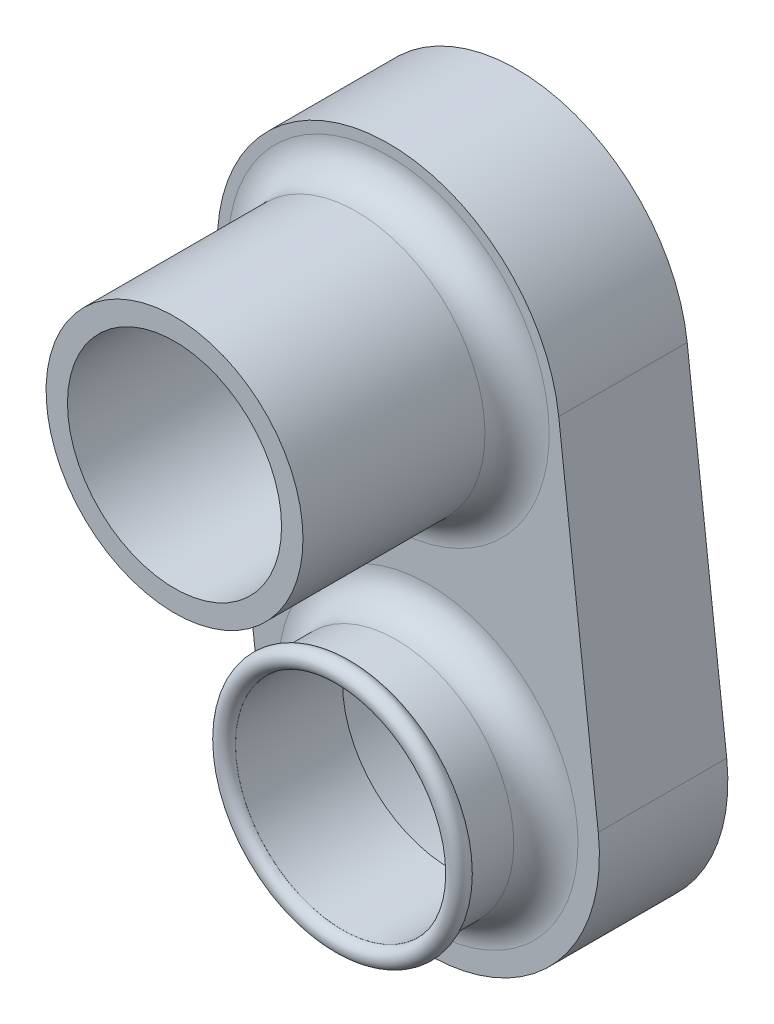
ISO-10303-21;
HEADER;
FILE_DESCRIPTION(('STEP AP214'),'2;1');
FILE_NAME('part.step','',(''),(''),'','','');
FILE_SCHEMA(('AUTOMOTIVE_DESIGN { 1 0 10303 214 1 1 1 1 }'));
ENDSEC;
DATA;
#1=APPLICATION_CONTEXT('core data for automotive mechanical design processes');
#2=APPLICATION_PROTOCOL_DEFINITION('international standard','automotive_design',2000,#1);
#3=PRODUCT_CONTEXT('',#1,'mechanical');
#4=PRODUCT('Part','Part','',(#3));
#5=PRODUCT_RELATED_PRODUCT_CATEGORY('part','',(#4));
#6=PRODUCT_DEFINITION_FORMATION('','',#4);
#7=PRODUCT_DEFINITION_CONTEXT('part definition',#1,'design');
#8=PRODUCT_DEFINITION('design','',#6,#7);
#9=PRODUCT_DEFINITION_SHAPE('','',#8);
#10=(LENGTH_UNIT() NAMED_UNIT(*) SI_UNIT(.MILLI.,.METRE.));
#11=(NAMED_UNIT(*) PLANE_ANGLE_UNIT() SI_UNIT($,.RADIAN.));
#12=(NAMED_UNIT(*) SI_UNIT($,.STERADIAN.) SOLID_ANGLE_UNIT());
#13=UNCERTAINTY_MEASURE_WITH_UNIT(LENGTH_MEASURE(1.E-05),#10,'distance_accuracy_value','');
#14=(GEOMETRIC_REPRESENTATION_CONTEXT(3) GLOBAL_UNCERTAINTY_ASSIGNED_CONTEXT((#13)) GLOBAL_UNIT_ASSIGNED_CONTEXT((#10,
#11,#12)) REPRESENTATION_CONTEXT('',''));
#15=CARTESIAN_POINT('',(0.,0.,0.));
#16=DIRECTION('',(0.,0.,1.));
#17=DIRECTION('',(1.,0.,0.));
#18=AXIS2_PLACEMENT_3D('',#15,#16,#17);
#19=CARTESIAN_POINT('',(550.233603989508,25.6899886030883,240.190394221551));
#20=DIRECTION('',(0.,0.,1.));
#21=DIRECTION('',(-0.993314481568456,-0.115439770904089,0.));
#22=AXIS2_PLACEMENT_3D('',#19,#20,#21);
#23=PLANE('',#22);
#24=CARTESIAN_POINT('',(550.233603989508,25.6899886030883,240.190394221551));
#25=DIRECTION('',(0.,0.,1.));
#26=DIRECTION('',(-0.993314481568456,-0.115439770904089,0.));
#27=AXIS2_PLACEMENT_3D('',#24,#25,#26);
#28=CIRCLE('',#27,10.);
#29=CARTESIAN_POINT('',(540.300459173823,24.5355908940474,240.190394221551));
#30=VERTEX_POINT('',#29);
#31=EDGE_CURVE('E155',#30,#30,#28,.T.);
#32=ORIENTED_EDGE('',*,*,#31,.F.);
#33=EDGE_LOOP('',(#32));
#34=FACE_BOUND('',#33,.T.);
#35=CARTESIAN_POINT('',(550.233603989508,25.6899886030883,240.190394221551));
#36=DIRECTION('',(0.,0.,-1.));
#37=DIRECTION('',(0.993314481568456,0.115439770904089,0.));
#38=AXIS2_PLACEMENT_3D('',#35,#36,#37);
#39=CIRCLE('',#38,10.0065008978472);
#40=CARTESIAN_POINT('',(560.173206241167,26.8451367742873,240.190394221551));
#41=VERTEX_POINT('',#40);
#42=EDGE_CURVE('E152',#41,#41,#39,.F.);
#43=ORIENTED_EDGE('',*,*,#42,.T.);
#44=EDGE_LOOP('',(#43));
#45=FACE_BOUND('',#44,.T.);
#46=ADVANCED_FACE('F40',(#34,#45),#23,.T.);
#47=CARTESIAN_POINT('',(550.233603989508,25.6899886030883,240.190394221551));
#48=DIRECTION('',(0.,0.,-1.));
#49=DIRECTION('',(0.993314481568456,0.115439770904089,0.));
#50=AXIS2_PLACEMENT_3D('',#47,#48,#49);
#51=CYLINDRICAL_SURFACE('',#50,11.);
#52=CARTESIAN_POINT('',(550.233603989508,25.6899886030883,235.190394221551));
#53=DIRECTION('',(0.,0.,-1.));
#54=DIRECTION('',(0.993314481568456,0.115439770904089,0.));
#55=AXIS2_PLACEMENT_3D('',#52,#53,#54);
#56=CIRCLE('',#55,11.);
#57=CARTESIAN_POINT('',(561.160063286761,26.9598260830333,235.190394221551));
#58=VERTEX_POINT('',#57);
#59=EDGE_CURVE('E11',#58,#58,#56,.F.);
#60=ORIENTED_EDGE('',*,*,#59,.T.);
#61=EDGE_LOOP('',(#60));
#62=FACE_BOUND('',#61,.T.);
#63=CARTESIAN_POINT('',(550.233603989508,25.6899886030883,239.318403734785));
#64=DIRECTION('',(0.,0.,1.));
#65=DIRECTION('',(-0.993314481568456,-0.115439770904089,0.));
#66=AXIS2_PLACEMENT_3D('',#63,#64,#65);
#67=CIRCLE('',#66,11.);
#68=CARTESIAN_POINT('',(539.307144692255,24.4201511231433,239.318403734785));
#69=VERTEX_POINT('',#68);
#70=EDGE_CURVE('E191',#69,#69,#67,.T.);
#71=ORIENTED_EDGE('',*,*,#70,.F.);
#72=EDGE_LOOP('',(#71));
#73=FACE_BOUND('',#72,.T.);
#74=ADVANCED_FACE('F215',(#62,#73),#51,.T.);
#75=CARTESIAN_POINT('',(546.539531320577,57.4760520132789,232.190394221551));
#76=DIRECTION('',(0.,0.,-1.));
#77=DIRECTION('',(0.993314481568456,0.115439770904089,0.));
#78=AXIS2_PLACEMENT_3D('',#75,#76,#77);
#79=PLANE('',#78);
#80=CARTESIAN_POINT('',(546.539531320577,57.4760520132789,232.190394221551));
#81=DIRECTION('',(0.,0.,-1.));
#82=DIRECTION('',(0.993314481568456,0.115439770904089,0.));
#83=AXIS2_PLACEMENT_3D('',#80,#81,#82);
#84=CIRCLE('',#83,15.);
#85=CARTESIAN_POINT('',(561.439248544104,59.2076485768402,232.190394221551));
#86=VERTEX_POINT('',#85);
#87=EDGE_CURVE('E197',#86,#86,#84,.T.);
#88=ORIENTED_EDGE('',*,*,#87,.T.);
#89=EDGE_LOOP('',(#88));
#90=FACE_BOUND('',#89,.T.);
#91=CARTESIAN_POINT('',(550.233603989508,25.6899886030883,232.190394221551));
#92=DIRECTION('',(0.,0.,-1.));
#93=DIRECTION('',(0.993314481568456,0.115439770904089,0.));
#94=AXIS2_PLACEMENT_3D('',#91,#92,#93);
#95=CIRCLE('',#94,14.);
#96=CARTESIAN_POINT('',(564.140006731466,27.3061453957455,232.190394221551));
#97=VERTEX_POINT('',#96);
#98=EDGE_CURVE('E194',#97,#97,#95,.T.);
#99=ORIENTED_EDGE('',*,*,#98,.T.);
#100=EDGE_LOOP('',(#99));
#101=FACE_BOUND('',#100,.T.);
#102=CARTESIAN_POINT('',(546.539531320577,57.4760520132789,232.190394221551));
#103=DIRECTION('',(0.,0.,-1.));
#104=DIRECTION('',(0.993314481568456,0.115439770904089,0.));
#105=AXIS2_PLACEMENT_3D('',#102,#103,#104);
#106=CIRCLE('',#105,16.);
#107=CARTESIAN_POINT('',(530.646499615482,55.6290156788135,232.190394221551));
#108=VERTEX_POINT('',#107);
#109=CARTESIAN_POINT('',(562.432563025672,59.3230883477443,232.190394221551));
#110=VERTEX_POINT('',#109);
#111=EDGE_CURVE('E164',#108,#110,#106,.T.);
#112=ORIENTED_EDGE('',*,*,#111,.F.);
#113=DIRECTION('',(-0.115439770904089,0.993314481568456,0.));
#114=VECTOR('',#113,1.);
#115=CARTESIAN_POINT('',(530.646499615482,55.6290156788135,232.190394221551));
#116=LINE('',#115,#114);
#117=CARTESIAN_POINT('',(534.340572284412,23.8429522686229,232.190394221551));
#118=VERTEX_POINT('',#117);
#119=EDGE_CURVE('E171',#118,#108,#116,.T.);
#120=ORIENTED_EDGE('',*,*,#119,.F.);
#121=CARTESIAN_POINT('',(550.233603989508,25.6899886030883,232.190394221551));
#122=DIRECTION('',(0.,0.,-1.));
#123=DIRECTION('',(-0.993314481568456,-0.115439770904089,0.));
#124=AXIS2_PLACEMENT_3D('',#121,#122,#123);
#125=CIRCLE('',#124,16.);
#126=CARTESIAN_POINT('',(566.126635694603,27.5370249375537,232.190394221551));
#127=VERTEX_POINT('',#126);
#128=EDGE_CURVE('E169',#127,#118,#125,.T.);
#129=ORIENTED_EDGE('',*,*,#128,.F.);
#130=DIRECTION('',(0.115439770904089,-0.993314481568456,0.));
#131=VECTOR('',#130,1.);
#132=CARTESIAN_POINT('',(562.432563025672,59.3230883477443,232.190394221551));
#133=LINE('',#132,#131);
#134=EDGE_CURVE('E167',#110,#127,#133,.T.);
#135=ORIENTED_EDGE('',*,*,#134,.F.);
#136=EDGE_LOOP('',(#112,#120,#129,#135));
#137=FACE_BOUND('',#136,.T.);
#138=ADVANCED_FACE('F211',(#90,#101,#137),#79,.F.);
#139=CARTESIAN_POINT('',(546.539531320577,57.4760520132789,252.190394221551));
#140=DIRECTION('',(0.,0.,-1.));
#141=DIRECTION('',(0.993314481568456,0.115439770904089,0.));
#142=AXIS2_PLACEMENT_3D('',#139,#140,#141);
#143=PLANE('',#142);
#144=CARTESIAN_POINT('',(546.539531320577,57.4760520132789,252.190394221551));
#145=DIRECTION('',(0.,0.,-1.));
#146=DIRECTION('',(0.993314481568456,0.115439770904089,0.));
#147=AXIS2_PLACEMENT_3D('',#144,#145,#146);
#148=CIRCLE('',#147,12.);
#149=CARTESIAN_POINT('',(558.459305099398,58.861329264128,252.190394221551));
#150=VERTEX_POINT('',#149);
#151=EDGE_CURVE('E188',#150,#150,#148,.T.);
#152=ORIENTED_EDGE('',*,*,#151,.F.);
#153=EDGE_LOOP('',(#152));
#154=FACE_BOUND('',#153,.T.);
#155=CARTESIAN_POINT('',(546.539531320577,57.4760520132789,252.190394221551));
#156=DIRECTION('',(0.,0.,-1.));
#157=DIRECTION('',(0.993314481568456,0.115439770904089,0.));
#158=AXIS2_PLACEMENT_3D('',#155,#156,#157);
#159=CIRCLE('',#158,10.);
#160=CARTESIAN_POINT('',(556.472676136261,58.6304497223198,252.190394221551));
#161=VERTEX_POINT('',#160);
#162=EDGE_CURVE('E185',#161,#161,#159,.T.);
#163=ORIENTED_EDGE('',*,*,#162,.T.);
#164=EDGE_LOOP('',(#163));
#165=FACE_BOUND('',#164,.T.);
#166=ADVANCED_FACE('F214',(#154,#165),#143,.F.);
#167=CARTESIAN_POINT('',(546.539531320577,57.4760520132789,232.190394221551));
#168=DIRECTION('',(0.,0.,1.));
#169=DIRECTION('',(-0.993314481568456,-0.115439770904089,0.));
#170=AXIS2_PLACEMENT_3D('',#167,#168,#169);
#171=CYLINDRICAL_SURFACE('',#170,12.);
#172=CARTESIAN_POINT('',(546.539531320577,57.4760520132789,235.190394221551));
#173=DIRECTION('',(0.,0.,-1.));
#174=DIRECTION('',(0.993314481568456,0.115439770904089,0.));
#175=AXIS2_PLACEMENT_3D('',#172,#173,#174);
#176=CIRCLE('',#175,12.);
#177=CARTESIAN_POINT('',(558.459305099398,58.861329264128,235.190394221551));
#178=VERTEX_POINT('',#177);
#179=EDGE_CURVE('E48',#178,#178,#176,.F.);
#180=ORIENTED_EDGE('',*,*,#179,.T.);
#181=EDGE_LOOP('',(#180));
#182=FACE_BOUND('',#181,.T.);
#183=ORIENTED_EDGE('',*,*,#151,.T.);
#184=EDGE_LOOP('',(#183));
#185=FACE_BOUND('',#184,.T.);
#186=ADVANCED_FACE('F202',(#182,#185),#171,.T.);
#187=CARTESIAN_POINT('',(546.539531320577,57.4760520132789,232.190394221551));
#188=DIRECTION('',(0.,0.,1.));
#189=DIRECTION('',(-0.993314481568456,-0.115439770904089,0.));
#190=AXIS2_PLACEMENT_3D('',#187,#188,#189);
#191=CYLINDRICAL_SURFACE('',#190,10.);
#192=ORIENTED_EDGE('',*,*,#162,.F.);
#193=EDGE_LOOP('',(#192));
#194=FACE_BOUND('',#193,.T.);
#195=CARTESIAN_POINT('',(546.539531320577,57.4760520132789,230.190394221551));
#196=DIRECTION('',(0.,0.,-1.));
#197=DIRECTION('',(0.993314481568456,0.115439770904089,0.));
#198=AXIS2_PLACEMENT_3D('',#195,#196,#197);
#199=CIRCLE('',#198,10.);
#200=CARTESIAN_POINT('',(556.472676136261,58.6304497223198,230.190394221551));
#201=VERTEX_POINT('',#200);
#202=EDGE_CURVE('E161',#201,#201,#199,.T.);
#203=ORIENTED_EDGE('',*,*,#202,.T.);
#204=EDGE_LOOP('',(#203));
#205=FACE_BOUND('',#204,.T.);
#206=ADVANCED_FACE('F263',(#194,#205),#191,.F.);
#207=CARTESIAN_POINT('',(546.539531320577,57.4760520132789,230.190394221551));
#208=DIRECTION('',(0.,0.,-1.));
#209=DIRECTION('',(0.993314481568456,0.115439770904089,0.));
#210=AXIS2_PLACEMENT_3D('',#207,#208,#209);
#211=PLANE('',#210);
#212=CARTESIAN_POINT('',(550.233603989508,25.6899886030883,230.190394221551));
#213=DIRECTION('',(0.,0.,-1.));
#214=DIRECTION('',(0.993314481568456,0.115439770904089,0.));
#215=AXIS2_PLACEMENT_3D('',#212,#213,#214);
#216=CIRCLE('',#215,15.);
#217=CARTESIAN_POINT('',(565.133321213034,27.4215851666496,230.190394221551));
#218=VERTEX_POINT('',#217);
#219=CARTESIAN_POINT('',(535.333886765981,23.958392039527,230.190394221551));
#220=VERTEX_POINT('',#219);
#221=EDGE_CURVE('E55',#218,#220,#216,.T.);
#222=ORIENTED_EDGE('',*,*,#221,.T.);
#223=DIRECTION('',(-0.115439770904089,0.993314481568456,0.));
#224=VECTOR('',#223,1.);
#225=CARTESIAN_POINT('',(535.333886765981,23.958392039527,230.190394221551));
#226=LINE('',#225,#224);
#227=CARTESIAN_POINT('',(531.63981409705,55.7444554497176,230.190394221551));
#228=VERTEX_POINT('',#227);
#229=EDGE_CURVE('E59',#220,#228,#226,.T.);
#230=ORIENTED_EDGE('',*,*,#229,.T.);
#231=CARTESIAN_POINT('',(546.539531320577,57.4760520132789,230.190394221551));
#232=DIRECTION('',(0.,0.,-1.));
#233=DIRECTION('',(0.993314481568456,0.115439770904089,0.));
#234=AXIS2_PLACEMENT_3D('',#231,#232,#233);
#235=CIRCLE('',#234,15.);
#236=CARTESIAN_POINT('',(561.439248544104,59.2076485768402,230.190394221551));
#237=VERTEX_POINT('',#236);
#238=EDGE_CURVE('E133',#228,#237,#235,.T.);
#239=ORIENTED_EDGE('',*,*,#238,.T.);
#240=DIRECTION('',(0.115439770904089,-0.993314481568456,0.));
#241=VECTOR('',#240,1.);
#242=CARTESIAN_POINT('',(561.439248544104,59.2076485768402,230.190394221551));
#243=LINE('',#242,#241);
#244=EDGE_CURVE('E114',#237,#218,#243,.T.);
#245=ORIENTED_EDGE('',*,*,#244,.T.);
#246=EDGE_LOOP('',(#222,#230,#239,#245));
#247=FACE_BOUND('',#246,.T.);
#248=ORIENTED_EDGE('',*,*,#202,.F.);
#249=EDGE_LOOP('',(#248));
#250=FACE_BOUND('',#249,.T.);
#251=CARTESIAN_POINT('',(550.233603989508,25.6899886030883,230.190394221551));
#252=DIRECTION('',(0.,0.,-1.));
#253=DIRECTION('',(-0.993314481568456,-0.115439770904089,0.));
#254=AXIS2_PLACEMENT_3D('',#251,#252,#253);
#255=CIRCLE('',#254,10.);
#256=CARTESIAN_POINT('',(540.300459173823,24.5355908940474,230.190394221551));
#257=VERTEX_POINT('',#256);
#258=EDGE_CURVE('E158',#257,#257,#255,.T.);
#259=ORIENTED_EDGE('',*,*,#258,.F.);
#260=EDGE_LOOP('',(#259));
#261=FACE_BOUND('',#260,.T.);
#262=ADVANCED_FACE('F242',(#247,#250,#261),#211,.T.);
#263=CARTESIAN_POINT('',(546.539531320577,57.4760520132789,230.190394221551));
#264=DIRECTION('',(0.,0.,1.));
#265=DIRECTION('',(-0.993314481568456,-0.115439770904089,0.));
#266=AXIS2_PLACEMENT_3D('',#263,#264,#265);
#267=CYLINDRICAL_SURFACE('',#266,16.);
#268=ORIENTED_EDGE('',*,*,#111,.T.);
#269=DIRECTION('',(0.,0.,1.));
#270=VECTOR('',#269,1.);
#271=CARTESIAN_POINT('',(562.432563025672,59.3230883477443,230.190394221551));
#272=LINE('',#271,#270);
#273=CARTESIAN_POINT('',(562.432563025672,59.3230883477443,220.190394221551));
#274=VERTEX_POINT('',#273);
#275=EDGE_CURVE('E182',#274,#110,#272,.T.);
#276=ORIENTED_EDGE('',*,*,#275,.F.);
#277=CARTESIAN_POINT('',(546.539531320577,57.4760520132789,220.190394221551));
#278=DIRECTION('',(0.,0.,-1.));
#279=DIRECTION('',(0.993314481568456,0.115439770904089,0.));
#280=AXIS2_PLACEMENT_3D('',#277,#278,#279);
#281=CIRCLE('',#280,16.);
#282=CARTESIAN_POINT('',(530.646499615482,55.6290156788135,220.190394221551));
#283=VERTEX_POINT('',#282);
#284=EDGE_CURVE('E119',#283,#274,#281,.T.);
#285=ORIENTED_EDGE('',*,*,#284,.F.);
#286=DIRECTION('',(0.,0.,1.));
#287=VECTOR('',#286,1.);
#288=CARTESIAN_POINT('',(530.646499615482,55.6290156788135,230.190394221551));
#289=LINE('',#288,#287);
#290=EDGE_CURVE('E173',#283,#108,#289,.T.);
#291=ORIENTED_EDGE('',*,*,#290,.T.);
#292=EDGE_LOOP('',(#268,#276,#285,#291));
#293=FACE_BOUND('',#292,.T.);
#294=ADVANCED_FACE('F223',(#293),#267,.T.);
#295=CARTESIAN_POINT('',(562.432563025672,59.3230883477443,230.190394221551));
#296=DIRECTION('',(-0.993314481568456,-0.115439770904089,0.));
#297=DIRECTION('',(-0.115439770904089,0.993314481568456,0.));
#298=AXIS2_PLACEMENT_3D('',#295,#296,#297);
#299=PLANE('',#298);
#300=ORIENTED_EDGE('',*,*,#134,.T.);
#301=DIRECTION('',(0.,0.,1.));
#302=VECTOR('',#301,1.);
#303=CARTESIAN_POINT('',(566.126635694603,27.5370249375537,230.190394221551));
#304=LINE('',#303,#302);
#305=CARTESIAN_POINT('',(566.126635694603,27.5370249375537,220.190394221551));
#306=VERTEX_POINT('',#305);
#307=EDGE_CURVE('E179',#306,#127,#304,.T.);
#308=ORIENTED_EDGE('',*,*,#307,.F.);
#309=DIRECTION('',(0.115439770904089,-0.993314481568456,0.));
#310=VECTOR('',#309,1.);
#311=CARTESIAN_POINT('',(562.432563025672,59.3230883477443,220.190394221551));
#312=LINE('',#311,#310);
#313=EDGE_CURVE('E143',#274,#306,#312,.T.);
#314=ORIENTED_EDGE('',*,*,#313,.F.);
#315=ORIENTED_EDGE('',*,*,#275,.T.);
#316=EDGE_LOOP('',(#300,#308,#314,#315));
#317=FACE_BOUND('',#316,.T.);
#318=ADVANCED_FACE('F234',(#317),#299,.F.);
#319=CARTESIAN_POINT('',(550.233603989508,25.6899886030883,230.190394221551));
#320=DIRECTION('',(0.,0.,1.));
#321=DIRECTION('',(-0.993314481568456,-0.115439770904089,0.));
#322=AXIS2_PLACEMENT_3D('',#319,#320,#321);
#323=CYLINDRICAL_SURFACE('',#322,16.);
#324=ORIENTED_EDGE('',*,*,#128,.T.);
#325=DIRECTION('',(0.,0.,1.));
#326=VECTOR('',#325,1.);
#327=CARTESIAN_POINT('',(534.340572284412,23.8429522686229,230.190394221551));
#328=LINE('',#327,#326);
#329=CARTESIAN_POINT('',(534.340572284412,23.8429522686229,220.190394221551));
#330=VERTEX_POINT('',#329);
#331=EDGE_CURVE('E176',#330,#118,#328,.T.);
#332=ORIENTED_EDGE('',*,*,#331,.F.);
#333=CARTESIAN_POINT('',(550.233603989508,25.6899886030883,220.190394221551));
#334=DIRECTION('',(0.,0.,-1.));
#335=DIRECTION('',(0.993314481568456,0.115439770904089,0.));
#336=AXIS2_PLACEMENT_3D('',#333,#334,#335);
#337=CIRCLE('',#336,16.);
#338=EDGE_CURVE('E146',#306,#330,#337,.T.);
#339=ORIENTED_EDGE('',*,*,#338,.F.);
#340=ORIENTED_EDGE('',*,*,#307,.T.);
#341=EDGE_LOOP('',(#324,#332,#339,#340));
#342=FACE_BOUND('',#341,.T.);
#343=ADVANCED_FACE('F232',(#342),#323,.T.);
#344=CARTESIAN_POINT('',(530.646499615482,55.6290156788135,230.190394221551));
#345=DIRECTION('',(0.993314481568456,0.115439770904089,0.));
#346=DIRECTION('',(0.115439770904089,-0.993314481568456,0.));
#347=AXIS2_PLACEMENT_3D('',#344,#345,#346);
#348=PLANE('',#347);
#349=ORIENTED_EDGE('',*,*,#119,.T.);
#350=ORIENTED_EDGE('',*,*,#290,.F.);
#351=DIRECTION('',(-0.115439770904089,0.993314481568456,0.));
#352=VECTOR('',#351,1.);
#353=CARTESIAN_POINT('',(534.340572284412,23.8429522686229,220.190394221551));
#354=LINE('',#353,#352);
#355=EDGE_CURVE('E149',#330,#283,#354,.T.);
#356=ORIENTED_EDGE('',*,*,#355,.F.);
#357=ORIENTED_EDGE('',*,*,#331,.T.);
#358=EDGE_LOOP('',(#349,#350,#356,#357));
#359=FACE_BOUND('',#358,.T.);
#360=ADVANCED_FACE('F228',(#359),#348,.F.);
#361=CARTESIAN_POINT('',(550.233603989508,25.6899886030883,230.190394221551));
#362=DIRECTION('',(0.,0.,1.));
#363=DIRECTION('',(-0.993314481568456,-0.115439770904089,0.));
#364=AXIS2_PLACEMENT_3D('',#361,#362,#363);
#365=CYLINDRICAL_SURFACE('',#364,10.);
#366=ORIENTED_EDGE('',*,*,#258,.T.);
#367=EDGE_LOOP('',(#366));
#368=FACE_BOUND('',#367,.T.);
#369=ORIENTED_EDGE('',*,*,#31,.T.);
#370=EDGE_LOOP('',(#369));
#371=FACE_BOUND('',#370,.T.);
#372=ADVANCED_FACE('F258',(#368,#371),#365,.F.);
#373=CARTESIAN_POINT('',(550.233603989508,25.6899886030883,240.190394221551));
#374=DIRECTION('',(0.,0.,1.));
#375=DIRECTION('',(-0.993314481568456,-0.115439770904089,0.));
#376=AXIS2_PLACEMENT_3D('',#373,#374,#375);
#377=TOROIDAL_SURFACE('',#376,10.8859218611894,0.879420963342187);
#378=ORIENTED_EDGE('',*,*,#42,.F.);
#379=EDGE_LOOP('',(#378));
#380=FACE_BOUND('',#379,.T.);
#381=ORIENTED_EDGE('',*,*,#70,.T.);
#382=EDGE_LOOP('',(#381));
#383=FACE_BOUND('',#382,.T.);
#384=ADVANCED_FACE('F255',(#380,#383),#377,.T.);
#385=CARTESIAN_POINT('',(546.539531320577,57.4760520132789,220.190394221551));
#386=DIRECTION('',(0.,0.,-1.));
#387=DIRECTION('',(0.993314481568456,0.115439770904089,0.));
#388=AXIS2_PLACEMENT_3D('',#385,#386,#387);
#389=PLANE('',#388);
#390=ORIENTED_EDGE('',*,*,#284,.T.);
#391=ORIENTED_EDGE('',*,*,#313,.T.);
#392=ORIENTED_EDGE('',*,*,#338,.T.);
#393=ORIENTED_EDGE('',*,*,#355,.T.);
#394=EDGE_LOOP('',(#390,#391,#392,#393));
#395=FACE_BOUND('',#394,.T.);
#396=DIRECTION('',(-0.115439770904089,0.993314481568456,0.));
#397=VECTOR('',#396,1.);
#398=CARTESIAN_POINT('',(535.333886765981,23.958392039527,220.190394221551));
#399=LINE('',#398,#397);
#400=CARTESIAN_POINT('',(535.333886765981,23.958392039527,220.190394221551));
#401=VERTEX_POINT('',#400);
#402=CARTESIAN_POINT('',(531.63981409705,55.7444554497176,220.190394221551));
#403=VERTEX_POINT('',#402);
#404=EDGE_CURVE('E113',#401,#403,#399,.T.);
#405=ORIENTED_EDGE('',*,*,#404,.F.);
#406=CARTESIAN_POINT('',(550.233603989508,25.6899886030883,220.190394221551));
#407=DIRECTION('',(0.,0.,-1.));
#408=DIRECTION('',(0.993314481568456,0.115439770904089,0.));
#409=AXIS2_PLACEMENT_3D('',#406,#407,#408);
#410=CIRCLE('',#409,15.);
#411=CARTESIAN_POINT('',(565.133321213034,27.4215851666496,220.190394221551));
#412=VERTEX_POINT('',#411);
#413=EDGE_CURVE('E104',#412,#401,#410,.T.);
#414=ORIENTED_EDGE('',*,*,#413,.F.);
#415=DIRECTION('',(0.115439770904089,-0.993314481568456,0.));
#416=VECTOR('',#415,1.);
#417=CARTESIAN_POINT('',(561.439248544104,59.2076485768402,220.190394221551));
#418=LINE('',#417,#416);
#419=CARTESIAN_POINT('',(561.439248544104,59.2076485768402,220.190394221551));
#420=VERTEX_POINT('',#419);
#421=EDGE_CURVE('E127',#420,#412,#418,.T.);
#422=ORIENTED_EDGE('',*,*,#421,.F.);
#423=CARTESIAN_POINT('',(546.539531320577,57.4760520132789,220.190394221551));
#424=DIRECTION('',(0.,0.,-1.));
#425=DIRECTION('',(0.993314481568456,0.115439770904089,0.));
#426=AXIS2_PLACEMENT_3D('',#423,#424,#425);
#427=CIRCLE('',#426,15.);
#428=EDGE_CURVE('E125',#403,#420,#427,.T.);
#429=ORIENTED_EDGE('',*,*,#428,.F.);
#430=EDGE_LOOP('',(#405,#414,#422,#429));
#431=FACE_BOUND('',#430,.T.);
#432=ADVANCED_FACE('F123',(#395,#431),#389,.T.);
#433=CARTESIAN_POINT('',(550.233603989508,25.6899886030883,220.190394221551));
#434=DIRECTION('',(0.,0.,1.));
#435=DIRECTION('',(-0.993314481568456,-0.115439770904089,0.));
#436=AXIS2_PLACEMENT_3D('',#433,#434,#435);
#437=CYLINDRICAL_SURFACE('',#436,15.);
#438=ORIENTED_EDGE('',*,*,#221,.F.);
#439=DIRECTION('',(0.,0.,1.));
#440=VECTOR('',#439,1.);
#441=CARTESIAN_POINT('',(565.133321213034,27.4215851666496,220.190394221551));
#442=LINE('',#441,#440);
#443=EDGE_CURVE('E109',#412,#218,#442,.T.);
#444=ORIENTED_EDGE('',*,*,#443,.F.);
#445=ORIENTED_EDGE('',*,*,#413,.T.);
#446=DIRECTION('',(0.,0.,1.));
#447=VECTOR('',#446,1.);
#448=CARTESIAN_POINT('',(535.333886765981,23.958392039527,220.190394221551));
#449=LINE('',#448,#447);
#450=EDGE_CURVE('E107',#401,#220,#449,.T.);
#451=ORIENTED_EDGE('',*,*,#450,.T.);
#452=EDGE_LOOP('',(#438,#444,#445,#451));
#453=FACE_BOUND('',#452,.T.);
#454=ADVANCED_FACE('F106',(#453),#437,.F.);
#455=CARTESIAN_POINT('',(535.333886765981,23.958392039527,220.190394221551));
#456=DIRECTION('',(0.993314481568456,0.115439770904089,0.));
#457=DIRECTION('',(0.115439770904089,-0.993314481568456,0.));
#458=AXIS2_PLACEMENT_3D('',#455,#456,#457);
#459=PLANE('',#458);
#460=ORIENTED_EDGE('',*,*,#229,.F.);
#461=ORIENTED_EDGE('',*,*,#450,.F.);
#462=ORIENTED_EDGE('',*,*,#404,.T.);
#463=DIRECTION('',(0.,0.,1.));
#464=VECTOR('',#463,1.);
#465=CARTESIAN_POINT('',(531.63981409705,55.7444554497176,220.190394221551));
#466=LINE('',#465,#464);
#467=EDGE_CURVE('E120',#403,#228,#466,.T.);
#468=ORIENTED_EDGE('',*,*,#467,.T.);
#469=EDGE_LOOP('',(#460,#461,#462,#468));
#470=FACE_BOUND('',#469,.T.);
#471=ADVANCED_FACE('F117',(#470),#459,.T.);
#472=CARTESIAN_POINT('',(546.539531320577,57.4760520132789,220.190394221551));
#473=DIRECTION('',(0.,0.,1.));
#474=DIRECTION('',(-0.993314481568456,-0.115439770904089,0.));
#475=AXIS2_PLACEMENT_3D('',#472,#473,#474);
#476=CYLINDRICAL_SURFACE('',#475,15.);
#477=ORIENTED_EDGE('',*,*,#238,.F.);
#478=ORIENTED_EDGE('',*,*,#467,.F.);
#479=ORIENTED_EDGE('',*,*,#428,.T.);
#480=DIRECTION('',(0.,0.,1.));
#481=VECTOR('',#480,1.);
#482=CARTESIAN_POINT('',(561.439248544104,59.2076485768402,220.190394221551));
#483=LINE('',#482,#481);
#484=EDGE_CURVE('E137',#420,#237,#483,.T.);
#485=ORIENTED_EDGE('',*,*,#484,.T.);
#486=EDGE_LOOP('',(#477,#478,#479,#485));
#487=FACE_BOUND('',#486,.T.);
#488=ADVANCED_FACE('F346',(#487),#476,.F.);
#489=CARTESIAN_POINT('',(561.439248544104,59.2076485768402,220.190394221551));
#490=DIRECTION('',(-0.993314481568456,-0.115439770904089,0.));
#491=DIRECTION('',(-0.115439770904089,0.993314481568456,0.));
#492=AXIS2_PLACEMENT_3D('',#489,#490,#491);
#493=PLANE('',#492);
#494=ORIENTED_EDGE('',*,*,#244,.F.);
#495=ORIENTED_EDGE('',*,*,#484,.F.);
#496=ORIENTED_EDGE('',*,*,#421,.T.);
#497=ORIENTED_EDGE('',*,*,#443,.T.);
#498=EDGE_LOOP('',(#494,#495,#496,#497));
#499=FACE_BOUND('',#498,.T.);
#500=ADVANCED_FACE('F208',(#499),#493,.T.);
#501=CARTESIAN_POINT('',(546.539531320577,57.4760520132789,235.190394221551));
#502=DIRECTION('',(0.,0.,-1.));
#503=DIRECTION('',(0.993314481568456,0.115439770904089,0.));
#504=AXIS2_PLACEMENT_3D('',#501,#502,#503);
#505=TOROIDAL_SURFACE('',#504,15.,3.);
#506=ORIENTED_EDGE('',*,*,#179,.F.);
#507=EDGE_LOOP('',(#506));
#508=FACE_BOUND('',#507,.T.);
#509=ORIENTED_EDGE('',*,*,#87,.F.);
#510=EDGE_LOOP('',(#509));
#511=FACE_BOUND('',#510,.T.);
#512=ADVANCED_FACE('F205',(#508,#511),#505,.F.);
#513=CARTESIAN_POINT('',(550.233603989508,25.6899886030883,235.190394221551));
#514=DIRECTION('',(0.,0.,-1.));
#515=DIRECTION('',(0.993314481568456,0.115439770904089,0.));
#516=AXIS2_PLACEMENT_3D('',#513,#514,#515);
#517=TOROIDAL_SURFACE('',#516,14.,3.);
#518=ORIENTED_EDGE('',*,*,#98,.F.);
#519=EDGE_LOOP('',(#518));
#520=FACE_BOUND('',#519,.T.);
#521=ORIENTED_EDGE('',*,*,#59,.F.);
#522=EDGE_LOOP('',(#521));
#523=FACE_BOUND('',#522,.T.);
#524=ADVANCED_FACE('F42',(#520,#523),#517,.F.);
#525=CLOSED_SHELL('',(#46,#74,#138,#166,#186,#206,#262,#294,#318,#343,#360,#372,#384,#432,#454,
#471,#488,#500,#512,#524));
#526=MANIFOLD_SOLID_BREP('B2',#525);
#527=ADVANCED_BREP_SHAPE_REPRESENTATION('',(#18,#526),#14);
#528=SHAPE_DEFINITION_REPRESENTATION(#9,#527);
ENDSEC;
END-ISO-10303-21;
